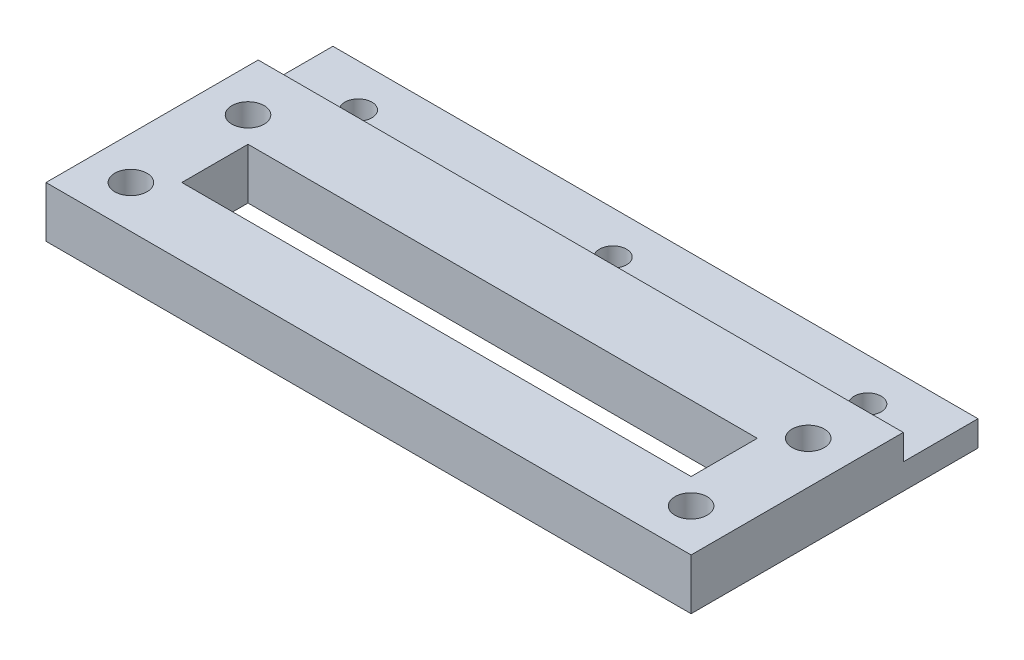
ISO-10303-21;
HEADER;
FILE_DESCRIPTION(('STEP AP214'),'2;1');
FILE_NAME('part.step','',(''),(''),'','','');
FILE_SCHEMA(('AUTOMOTIVE_DESIGN { 1 0 10303 214 1 1 1 1 }'));
ENDSEC;
DATA;
#1=APPLICATION_CONTEXT('core data for automotive mechanical design processes');
#2=APPLICATION_PROTOCOL_DEFINITION('international standard','automotive_design',2000,#1);
#3=PRODUCT_CONTEXT('',#1,'mechanical');
#4=PRODUCT('Part','Part','',(#3));
#5=PRODUCT_RELATED_PRODUCT_CATEGORY('part','',(#4));
#6=PRODUCT_DEFINITION_FORMATION('','',#4);
#7=PRODUCT_DEFINITION_CONTEXT('part definition',#1,'design');
#8=PRODUCT_DEFINITION('design','',#6,#7);
#9=PRODUCT_DEFINITION_SHAPE('','',#8);
#10=(LENGTH_UNIT() NAMED_UNIT(*) SI_UNIT(.MILLI.,.METRE.));
#11=(NAMED_UNIT(*) PLANE_ANGLE_UNIT() SI_UNIT($,.RADIAN.));
#12=(NAMED_UNIT(*) SI_UNIT($,.STERADIAN.) SOLID_ANGLE_UNIT());
#13=UNCERTAINTY_MEASURE_WITH_UNIT(LENGTH_MEASURE(1.E-05),#10,'distance_accuracy_value','');
#14=(GEOMETRIC_REPRESENTATION_CONTEXT(3) GLOBAL_UNCERTAINTY_ASSIGNED_CONTEXT((#13)) GLOBAL_UNIT_ASSIGNED_CONTEXT((#10,
#11,#12)) REPRESENTATION_CONTEXT('',''));
#15=CARTESIAN_POINT('',(0.,0.,0.));
#16=DIRECTION('',(0.,0.,1.));
#17=DIRECTION('',(1.,0.,0.));
#18=AXIS2_PLACEMENT_3D('',#15,#16,#17);
#19=CARTESIAN_POINT('',(0.,3.,0.));
#20=DIRECTION('',(0.,1.,0.));
#21=DIRECTION('',(0.,0.,1.));
#22=AXIS2_PLACEMENT_3D('',#19,#20,#21);
#23=PLANE('',#22);
#24=CARTESIAN_POINT('',(63.,3.,-10.));
#25=DIRECTION('',(0.,1.,0.));
#26=DIRECTION('',(0.,0.,1.));
#27=AXIS2_PLACEMENT_3D('',#24,#25,#26);
#28=CIRCLE('',#27,1.6);
#29=CARTESIAN_POINT('',(63.,3.,-8.4));
#30=VERTEX_POINT('',#29);
#31=EDGE_CURVE('E271',#30,#30,#28,.T.);
#32=ORIENTED_EDGE('',*,*,#31,.F.);
#33=EDGE_LOOP('',(#32));
#34=FACE_BOUND('',#33,.T.);
#35=CARTESIAN_POINT('',(33.,3.,-10.));
#36=DIRECTION('',(0.,1.,0.));
#37=DIRECTION('',(0.,0.,1.));
#38=AXIS2_PLACEMENT_3D('',#35,#36,#37);
#39=CIRCLE('',#38,1.6);
#40=CARTESIAN_POINT('',(33.,3.,-8.4));
#41=VERTEX_POINT('',#40);
#42=EDGE_CURVE('E277',#41,#41,#39,.T.);
#43=ORIENTED_EDGE('',*,*,#42,.F.);
#44=EDGE_LOOP('',(#43));
#45=FACE_BOUND('',#44,.T.);
#46=CARTESIAN_POINT('',(3.,3.,-10.));
#47=DIRECTION('',(0.,1.,0.));
#48=DIRECTION('',(0.,0.,1.));
#49=AXIS2_PLACEMENT_3D('',#46,#47,#48);
#50=CIRCLE('',#49,1.6);
#51=CARTESIAN_POINT('',(3.,3.,-8.4));
#52=VERTEX_POINT('',#51);
#53=EDGE_CURVE('E272',#52,#52,#50,.T.);
#54=ORIENTED_EDGE('',*,*,#53,.F.);
#55=EDGE_LOOP('',(#54));
#56=FACE_BOUND('',#55,.T.);
#57=DIRECTION('',(0.,0.,1.));
#58=VECTOR('',#57,1.);
#59=CARTESIAN_POINT('',(-5.,3.,0.));
#60=LINE('',#59,#58);
#61=CARTESIAN_POINT('',(-5.,3.,-15.));
#62=VERTEX_POINT('',#61);
#63=CARTESIAN_POINT('',(-5.,3.,-6.2));
#64=VERTEX_POINT('',#63);
#65=EDGE_CURVE('E302',#62,#64,#60,.T.);
#66=ORIENTED_EDGE('',*,*,#65,.T.);
#67=DIRECTION('',(1.,0.,0.));
#68=VECTOR('',#67,1.);
#69=CARTESIAN_POINT('',(-5.,3.,-6.2));
#70=LINE('',#69,#68);
#71=CARTESIAN_POINT('',(71.,3.,-6.2));
#72=VERTEX_POINT('',#71);
#73=EDGE_CURVE('E241',#64,#72,#70,.T.);
#74=ORIENTED_EDGE('',*,*,#73,.T.);
#75=DIRECTION('',(0.,0.,1.));
#76=VECTOR('',#75,1.);
#77=CARTESIAN_POINT('',(71.,3.,0.));
#78=LINE('',#77,#76);
#79=CARTESIAN_POINT('',(71.,3.,-15.));
#80=VERTEX_POINT('',#79);
#81=EDGE_CURVE('E306',#80,#72,#78,.T.);
#82=ORIENTED_EDGE('',*,*,#81,.F.);
#83=DIRECTION('',(1.,0.,0.));
#84=VECTOR('',#83,1.);
#85=CARTESIAN_POINT('',(-5.,3.,-15.));
#86=LINE('',#85,#84);
#87=EDGE_CURVE('E297',#62,#80,#86,.T.);
#88=ORIENTED_EDGE('',*,*,#87,.F.);
#89=EDGE_LOOP('',(#66,#74,#82,#88));
#90=FACE_BOUND('',#89,.T.);
#91=ADVANCED_FACE('F129',(#34,#45,#56,#90),#23,.T.);
#92=CARTESIAN_POINT('',(0.,0.,0.));
#93=DIRECTION('',(0.,1.,0.));
#94=DIRECTION('',(0.,0.,1.));
#95=AXIS2_PLACEMENT_3D('',#92,#93,#94);
#96=PLANE('',#95);
#97=DIRECTION('',(0.,0.,1.));
#98=VECTOR('',#97,1.);
#99=CARTESIAN_POINT('',(-5.,0.,0.));
#100=LINE('',#99,#98);
#101=CARTESIAN_POINT('',(-5.,0.,-15.));
#102=VERTEX_POINT('',#101);
#103=CARTESIAN_POINT('',(-5.,0.,18.8));
#104=VERTEX_POINT('',#103);
#105=EDGE_CURVE('E327',#102,#104,#100,.T.);
#106=ORIENTED_EDGE('',*,*,#105,.F.);
#107=DIRECTION('',(-1.,0.,0.));
#108=VECTOR('',#107,1.);
#109=CARTESIAN_POINT('',(71.,0.,-15.));
#110=LINE('',#109,#108);
#111=CARTESIAN_POINT('',(71.,0.,-15.));
#112=VERTEX_POINT('',#111);
#113=EDGE_CURVE('E288',#112,#102,#110,.T.);
#114=ORIENTED_EDGE('',*,*,#113,.F.);
#115=DIRECTION('',(0.,0.,1.));
#116=VECTOR('',#115,1.);
#117=CARTESIAN_POINT('',(71.,0.,0.));
#118=LINE('',#117,#116);
#119=CARTESIAN_POINT('',(71.,0.,18.8));
#120=VERTEX_POINT('',#119);
#121=EDGE_CURVE('E307',#112,#120,#118,.T.);
#122=ORIENTED_EDGE('',*,*,#121,.T.);
#123=DIRECTION('',(1.,0.,0.));
#124=VECTOR('',#123,1.);
#125=CARTESIAN_POINT('',(0.,0.,18.8));
#126=LINE('',#125,#124);
#127=EDGE_CURVE('E331',#104,#120,#126,.T.);
#128=ORIENTED_EDGE('',*,*,#127,.F.);
#129=EDGE_LOOP('',(#106,#114,#122,#128));
#130=FACE_BOUND('',#129,.T.);
#131=CARTESIAN_POINT('',(0.,0.,0.));
#132=DIRECTION('',(0.,1.,0.));
#133=DIRECTION('',(0.,0.,1.));
#134=AXIS2_PLACEMENT_3D('',#131,#132,#133);
#135=CIRCLE('',#134,1.9);
#136=CARTESIAN_POINT('',(0.,0.,1.9));
#137=VERTEX_POINT('',#136);
#138=EDGE_CURVE('E323',#137,#137,#135,.T.);
#139=ORIENTED_EDGE('',*,*,#138,.T.);
#140=EDGE_LOOP('',(#139));
#141=FACE_BOUND('',#140,.T.);
#142=CARTESIAN_POINT('',(0.,0.,13.8));
#143=DIRECTION('',(0.,1.,0.));
#144=DIRECTION('',(0.,0.,1.));
#145=AXIS2_PLACEMENT_3D('',#142,#143,#144);
#146=CIRCLE('',#145,1.9);
#147=CARTESIAN_POINT('',(0.,0.,15.7));
#148=VERTEX_POINT('',#147);
#149=EDGE_CURVE('E319',#148,#148,#146,.T.);
#150=ORIENTED_EDGE('',*,*,#149,.T.);
#151=EDGE_LOOP('',(#150));
#152=FACE_BOUND('',#151,.T.);
#153=CARTESIAN_POINT('',(66.,0.,0.));
#154=DIRECTION('',(0.,1.,0.));
#155=DIRECTION('',(0.,0.,1.));
#156=AXIS2_PLACEMENT_3D('',#153,#154,#155);
#157=CIRCLE('',#156,1.9);
#158=CARTESIAN_POINT('',(66.,0.,1.9));
#159=VERTEX_POINT('',#158);
#160=EDGE_CURVE('E315',#159,#159,#157,.T.);
#161=ORIENTED_EDGE('',*,*,#160,.T.);
#162=EDGE_LOOP('',(#161));
#163=FACE_BOUND('',#162,.T.);
#164=CARTESIAN_POINT('',(66.,0.,13.8));
#165=DIRECTION('',(0.,1.,0.));
#166=DIRECTION('',(0.,0.,1.));
#167=AXIS2_PLACEMENT_3D('',#164,#165,#166);
#168=CIRCLE('',#167,1.9);
#169=CARTESIAN_POINT('',(66.,0.,15.7));
#170=VERTEX_POINT('',#169);
#171=EDGE_CURVE('E301',#170,#170,#168,.T.);
#172=ORIENTED_EDGE('',*,*,#171,.T.);
#173=EDGE_LOOP('',(#172));
#174=FACE_BOUND('',#173,.T.);
#175=CARTESIAN_POINT('',(63.,0.,-10.));
#176=DIRECTION('',(0.,1.,0.));
#177=DIRECTION('',(0.,0.,1.));
#178=AXIS2_PLACEMENT_3D('',#175,#176,#177);
#179=CIRCLE('',#178,1.6);
#180=CARTESIAN_POINT('',(63.,0.,-8.4));
#181=VERTEX_POINT('',#180);
#182=EDGE_CURVE('E276',#181,#181,#179,.T.);
#183=ORIENTED_EDGE('',*,*,#182,.T.);
#184=EDGE_LOOP('',(#183));
#185=FACE_BOUND('',#184,.T.);
#186=CARTESIAN_POINT('',(33.,0.,-10.));
#187=DIRECTION('',(0.,1.,0.));
#188=DIRECTION('',(0.,0.,1.));
#189=AXIS2_PLACEMENT_3D('',#186,#187,#188);
#190=CIRCLE('',#189,1.6);
#191=CARTESIAN_POINT('',(33.,0.,-8.4));
#192=VERTEX_POINT('',#191);
#193=EDGE_CURVE('E348',#192,#192,#190,.T.);
#194=ORIENTED_EDGE('',*,*,#193,.T.);
#195=EDGE_LOOP('',(#194));
#196=FACE_BOUND('',#195,.T.);
#197=CARTESIAN_POINT('',(3.,0.,-10.));
#198=DIRECTION('',(0.,1.,0.));
#199=DIRECTION('',(0.,0.,1.));
#200=AXIS2_PLACEMENT_3D('',#197,#198,#199);
#201=CIRCLE('',#200,1.6);
#202=CARTESIAN_POINT('',(3.,0.,-8.4));
#203=VERTEX_POINT('',#202);
#204=EDGE_CURVE('E289',#203,#203,#201,.T.);
#205=ORIENTED_EDGE('',*,*,#204,.T.);
#206=EDGE_LOOP('',(#205));
#207=FACE_BOUND('',#206,.T.);
#208=DIRECTION('',(1.,0.,0.));
#209=VECTOR('',#208,1.);
#210=CARTESIAN_POINT('',(0.,0.,3.));
#211=LINE('',#210,#209);
#212=CARTESIAN_POINT('',(3.,0.,3.));
#213=VERTEX_POINT('',#212);
#214=CARTESIAN_POINT('',(63.,0.,3.));
#215=VERTEX_POINT('',#214);
#216=EDGE_CURVE('E12',#213,#215,#211,.T.);
#217=ORIENTED_EDGE('',*,*,#216,.F.);
#218=DIRECTION('',(0.,0.,1.));
#219=VECTOR('',#218,1.);
#220=CARTESIAN_POINT('',(3.,0.,0.));
#221=LINE('',#220,#219);
#222=CARTESIAN_POINT('',(3.,0.,10.8));
#223=VERTEX_POINT('',#222);
#224=EDGE_CURVE('E344',#213,#223,#221,.T.);
#225=ORIENTED_EDGE('',*,*,#224,.T.);
#226=DIRECTION('',(1.,0.,0.));
#227=VECTOR('',#226,1.);
#228=CARTESIAN_POINT('',(0.,0.,10.8));
#229=LINE('',#228,#227);
#230=CARTESIAN_POINT('',(63.,0.,10.8));
#231=VERTEX_POINT('',#230);
#232=EDGE_CURVE('E212',#223,#231,#229,.T.);
#233=ORIENTED_EDGE('',*,*,#232,.T.);
#234=DIRECTION('',(0.,0.,1.));
#235=VECTOR('',#234,1.);
#236=CARTESIAN_POINT('',(63.,0.,0.));
#237=LINE('',#236,#235);
#238=EDGE_CURVE('E138',#215,#231,#237,.T.);
#239=ORIENTED_EDGE('',*,*,#238,.F.);
#240=EDGE_LOOP('',(#217,#225,#233,#239));
#241=FACE_BOUND('',#240,.T.);
#242=ADVANCED_FACE('F365',(#130,#141,#152,#163,#174,#185,#196,#207,#241),#96,.F.);
#243=CARTESIAN_POINT('',(-5.,3.,0.));
#244=DIRECTION('',(1.,0.,0.));
#245=DIRECTION('',(0.,0.,-1.));
#246=AXIS2_PLACEMENT_3D('',#243,#244,#245);
#247=PLANE('',#246);
#248=ORIENTED_EDGE('',*,*,#105,.T.);
#249=DIRECTION('',(0.,-1.,0.));
#250=VECTOR('',#249,1.);
#251=CARTESIAN_POINT('',(-5.,3.,18.8));
#252=LINE('',#251,#250);
#253=CARTESIAN_POINT('',(-5.,6.,18.8));
#254=VERTEX_POINT('',#253);
#255=EDGE_CURVE('E340',#254,#104,#252,.T.);
#256=ORIENTED_EDGE('',*,*,#255,.F.);
#257=DIRECTION('',(0.,0.,1.));
#258=VECTOR('',#257,1.);
#259=CARTESIAN_POINT('',(-5.,6.,-6.2));
#260=LINE('',#259,#258);
#261=CARTESIAN_POINT('',(-5.,6.,-6.2));
#262=VERTEX_POINT('',#261);
#263=EDGE_CURVE('E253',#262,#254,#260,.T.);
#264=ORIENTED_EDGE('',*,*,#263,.F.);
#265=DIRECTION('',(0.,-1.,0.));
#266=VECTOR('',#265,1.);
#267=CARTESIAN_POINT('',(-5.,6.,-6.2));
#268=LINE('',#267,#266);
#269=EDGE_CURVE('E257',#262,#64,#268,.T.);
#270=ORIENTED_EDGE('',*,*,#269,.T.);
#271=ORIENTED_EDGE('',*,*,#65,.F.);
#272=DIRECTION('',(0.,1.,0.));
#273=VECTOR('',#272,1.);
#274=CARTESIAN_POINT('',(-5.,0.,-15.));
#275=LINE('',#274,#273);
#276=EDGE_CURVE('E293',#102,#62,#275,.T.);
#277=ORIENTED_EDGE('',*,*,#276,.F.);
#278=EDGE_LOOP('',(#248,#256,#264,#270,#271,#277));
#279=FACE_BOUND('',#278,.T.);
#280=ADVANCED_FACE('F385',(#279),#247,.F.);
#281=CARTESIAN_POINT('',(0.,3.,18.8));
#282=DIRECTION('',(0.,0.,-1.));
#283=DIRECTION('',(-1.,0.,0.));
#284=AXIS2_PLACEMENT_3D('',#281,#282,#283);
#285=PLANE('',#284);
#286=ORIENTED_EDGE('',*,*,#127,.T.);
#287=DIRECTION('',(0.,-1.,0.));
#288=VECTOR('',#287,1.);
#289=CARTESIAN_POINT('',(71.,3.,18.8));
#290=LINE('',#289,#288);
#291=CARTESIAN_POINT('',(71.,6.,18.8));
#292=VERTEX_POINT('',#291);
#293=EDGE_CURVE('E311',#292,#120,#290,.T.);
#294=ORIENTED_EDGE('',*,*,#293,.F.);
#295=DIRECTION('',(1.,0.,0.));
#296=VECTOR('',#295,1.);
#297=CARTESIAN_POINT('',(-5.,6.,18.8));
#298=LINE('',#297,#296);
#299=EDGE_CURVE('E242',#254,#292,#298,.T.);
#300=ORIENTED_EDGE('',*,*,#299,.F.);
#301=ORIENTED_EDGE('',*,*,#255,.T.);
#302=EDGE_LOOP('',(#286,#294,#300,#301));
#303=FACE_BOUND('',#302,.T.);
#304=ADVANCED_FACE('F398',(#303),#285,.F.);
#305=CARTESIAN_POINT('',(0.,3.,0.));
#306=DIRECTION('',(0.,-1.,0.));
#307=DIRECTION('',(0.,0.,-1.));
#308=AXIS2_PLACEMENT_3D('',#305,#306,#307);
#309=CYLINDRICAL_SURFACE('',#308,1.9);
#310=ORIENTED_EDGE('',*,*,#138,.F.);
#311=EDGE_LOOP('',(#310));
#312=FACE_BOUND('',#311,.T.);
#313=CARTESIAN_POINT('',(0.,6.,0.));
#314=DIRECTION('',(0.,1.,0.));
#315=DIRECTION('',(0.,0.,1.));
#316=AXIS2_PLACEMENT_3D('',#313,#314,#315);
#317=CIRCLE('',#316,1.9);
#318=CARTESIAN_POINT('',(0.,6.,1.9));
#319=VERTEX_POINT('',#318);
#320=EDGE_CURVE('E226',#319,#319,#317,.F.);
#321=ORIENTED_EDGE('',*,*,#320,.F.);
#322=EDGE_LOOP('',(#321));
#323=FACE_BOUND('',#322,.T.);
#324=ADVANCED_FACE('F401',(#312,#323),#309,.F.);
#325=CARTESIAN_POINT('',(0.,3.,13.8));
#326=DIRECTION('',(0.,-1.,0.));
#327=DIRECTION('',(0.,0.,-1.));
#328=AXIS2_PLACEMENT_3D('',#325,#326,#327);
#329=CYLINDRICAL_SURFACE('',#328,1.9);
#330=ORIENTED_EDGE('',*,*,#149,.F.);
#331=EDGE_LOOP('',(#330));
#332=FACE_BOUND('',#331,.T.);
#333=CARTESIAN_POINT('',(0.,6.,13.8));
#334=DIRECTION('',(0.,1.,0.));
#335=DIRECTION('',(0.,0.,1.));
#336=AXIS2_PLACEMENT_3D('',#333,#334,#335);
#337=CIRCLE('',#336,1.9);
#338=CARTESIAN_POINT('',(0.,6.,15.7));
#339=VERTEX_POINT('',#338);
#340=EDGE_CURVE('E430',#339,#339,#337,.F.);
#341=ORIENTED_EDGE('',*,*,#340,.F.);
#342=EDGE_LOOP('',(#341));
#343=FACE_BOUND('',#342,.T.);
#344=ADVANCED_FACE('F408',(#332,#343),#329,.F.);
#345=CARTESIAN_POINT('',(66.,3.,0.));
#346=DIRECTION('',(0.,-1.,0.));
#347=DIRECTION('',(0.,0.,-1.));
#348=AXIS2_PLACEMENT_3D('',#345,#346,#347);
#349=CYLINDRICAL_SURFACE('',#348,1.9);
#350=ORIENTED_EDGE('',*,*,#160,.F.);
#351=EDGE_LOOP('',(#350));
#352=FACE_BOUND('',#351,.T.);
#353=CARTESIAN_POINT('',(66.,6.,0.));
#354=DIRECTION('',(0.,1.,0.));
#355=DIRECTION('',(0.,0.,1.));
#356=AXIS2_PLACEMENT_3D('',#353,#354,#355);
#357=CIRCLE('',#356,1.9);
#358=CARTESIAN_POINT('',(66.,6.,1.9));
#359=VERTEX_POINT('',#358);
#360=EDGE_CURVE('E423',#359,#359,#357,.F.);
#361=ORIENTED_EDGE('',*,*,#360,.F.);
#362=EDGE_LOOP('',(#361));
#363=FACE_BOUND('',#362,.T.);
#364=ADVANCED_FACE('F411',(#352,#363),#349,.F.);
#365=CARTESIAN_POINT('',(66.,3.,13.8));
#366=DIRECTION('',(0.,-1.,0.));
#367=DIRECTION('',(0.,0.,-1.));
#368=AXIS2_PLACEMENT_3D('',#365,#366,#367);
#369=CYLINDRICAL_SURFACE('',#368,1.9);
#370=ORIENTED_EDGE('',*,*,#171,.F.);
#371=EDGE_LOOP('',(#370));
#372=FACE_BOUND('',#371,.T.);
#373=CARTESIAN_POINT('',(66.,6.,13.8));
#374=DIRECTION('',(0.,1.,0.));
#375=DIRECTION('',(0.,0.,1.));
#376=AXIS2_PLACEMENT_3D('',#373,#374,#375);
#377=CIRCLE('',#376,1.9);
#378=CARTESIAN_POINT('',(66.,6.,15.7));
#379=VERTEX_POINT('',#378);
#380=EDGE_CURVE('E426',#379,#379,#377,.F.);
#381=ORIENTED_EDGE('',*,*,#380,.F.);
#382=EDGE_LOOP('',(#381));
#383=FACE_BOUND('',#382,.T.);
#384=ADVANCED_FACE('F131',(#372,#383),#369,.F.);
#385=CARTESIAN_POINT('',(71.,3.,0.));
#386=DIRECTION('',(1.,0.,0.));
#387=DIRECTION('',(0.,0.,-1.));
#388=AXIS2_PLACEMENT_3D('',#385,#386,#387);
#389=PLANE('',#388);
#390=ORIENTED_EDGE('',*,*,#121,.F.);
#391=DIRECTION('',(0.,-1.,0.));
#392=VECTOR('',#391,1.);
#393=CARTESIAN_POINT('',(71.,3.,-15.));
#394=LINE('',#393,#392);
#395=EDGE_CURVE('E284',#80,#112,#394,.T.);
#396=ORIENTED_EDGE('',*,*,#395,.F.);
#397=ORIENTED_EDGE('',*,*,#81,.T.);
#398=DIRECTION('',(0.,-1.,0.));
#399=VECTOR('',#398,1.);
#400=CARTESIAN_POINT('',(71.,6.,-6.2));
#401=LINE('',#400,#399);
#402=CARTESIAN_POINT('',(71.,6.,-6.2));
#403=VERTEX_POINT('',#402);
#404=EDGE_CURVE('E145',#403,#72,#401,.T.);
#405=ORIENTED_EDGE('',*,*,#404,.F.);
#406=DIRECTION('',(0.,0.,1.));
#407=VECTOR('',#406,1.);
#408=CARTESIAN_POINT('',(71.,6.,-6.2));
#409=LINE('',#408,#407);
#410=EDGE_CURVE('E246',#403,#292,#409,.T.);
#411=ORIENTED_EDGE('',*,*,#410,.T.);
#412=ORIENTED_EDGE('',*,*,#293,.T.);
#413=EDGE_LOOP('',(#390,#396,#397,#405,#411,#412));
#414=FACE_BOUND('',#413,.T.);
#415=ADVANCED_FACE('F394',(#414),#389,.T.);
#416=CARTESIAN_POINT('',(0.,0.,-15.));
#417=DIRECTION('',(0.,0.,-1.));
#418=DIRECTION('',(-1.,0.,0.));
#419=AXIS2_PLACEMENT_3D('',#416,#417,#418);
#420=PLANE('',#419);
#421=ORIENTED_EDGE('',*,*,#395,.T.);
#422=ORIENTED_EDGE('',*,*,#113,.T.);
#423=ORIENTED_EDGE('',*,*,#276,.T.);
#424=ORIENTED_EDGE('',*,*,#87,.T.);
#425=EDGE_LOOP('',(#421,#422,#423,#424));
#426=FACE_BOUND('',#425,.T.);
#427=ADVANCED_FACE('F391',(#426),#420,.T.);
#428=CARTESIAN_POINT('',(63.,-7.,-10.));
#429=DIRECTION('',(0.,1.,0.));
#430=DIRECTION('',(0.,0.,1.));
#431=AXIS2_PLACEMENT_3D('',#428,#429,#430);
#432=CYLINDRICAL_SURFACE('',#431,1.6);
#433=ORIENTED_EDGE('',*,*,#31,.T.);
#434=EDGE_LOOP('',(#433));
#435=FACE_BOUND('',#434,.T.);
#436=ORIENTED_EDGE('',*,*,#182,.F.);
#437=EDGE_LOOP('',(#436));
#438=FACE_BOUND('',#437,.T.);
#439=ADVANCED_FACE('F538',(#435,#438),#432,.F.);
#440=CARTESIAN_POINT('',(33.,-7.,-10.));
#441=DIRECTION('',(0.,1.,0.));
#442=DIRECTION('',(0.,0.,1.));
#443=AXIS2_PLACEMENT_3D('',#440,#441,#442);
#444=CYLINDRICAL_SURFACE('',#443,1.6);
#445=ORIENTED_EDGE('',*,*,#42,.T.);
#446=EDGE_LOOP('',(#445));
#447=FACE_BOUND('',#446,.T.);
#448=ORIENTED_EDGE('',*,*,#193,.F.);
#449=EDGE_LOOP('',(#448));
#450=FACE_BOUND('',#449,.T.);
#451=ADVANCED_FACE('F376',(#447,#450),#444,.F.);
#452=CARTESIAN_POINT('',(3.,-7.,-10.));
#453=DIRECTION('',(0.,1.,0.));
#454=DIRECTION('',(0.,0.,1.));
#455=AXIS2_PLACEMENT_3D('',#452,#453,#454);
#456=CYLINDRICAL_SURFACE('',#455,1.6);
#457=ORIENTED_EDGE('',*,*,#53,.T.);
#458=EDGE_LOOP('',(#457));
#459=FACE_BOUND('',#458,.T.);
#460=ORIENTED_EDGE('',*,*,#204,.F.);
#461=EDGE_LOOP('',(#460));
#462=FACE_BOUND('',#461,.T.);
#463=ADVANCED_FACE('F369',(#459,#462),#456,.F.);
#464=CARTESIAN_POINT('',(3.,-7.,3.));
#465=DIRECTION('',(0.,0.,1.));
#466=DIRECTION('',(1.,0.,0.));
#467=AXIS2_PLACEMENT_3D('',#464,#465,#466);
#468=PLANE('',#467);
#469=ORIENTED_EDGE('',*,*,#216,.T.);
#470=DIRECTION('',(0.,1.,0.));
#471=VECTOR('',#470,1.);
#472=CARTESIAN_POINT('',(63.,-7.,3.));
#473=LINE('',#472,#471);
#474=CARTESIAN_POINT('',(63.,6.,3.));
#475=VERTEX_POINT('',#474);
#476=EDGE_CURVE('E268',#215,#475,#473,.T.);
#477=ORIENTED_EDGE('',*,*,#476,.T.);
#478=DIRECTION('',(1.,0.,0.));
#479=VECTOR('',#478,1.);
#480=CARTESIAN_POINT('',(0.,6.,3.));
#481=LINE('',#480,#479);
#482=CARTESIAN_POINT('',(3.,6.,3.));
#483=VERTEX_POINT('',#482);
#484=EDGE_CURVE('E235',#483,#475,#481,.T.);
#485=ORIENTED_EDGE('',*,*,#484,.F.);
#486=DIRECTION('',(0.,1.,0.));
#487=VECTOR('',#486,1.);
#488=CARTESIAN_POINT('',(3.,-7.,3.));
#489=LINE('',#488,#487);
#490=EDGE_CURVE('E216',#213,#483,#489,.T.);
#491=ORIENTED_EDGE('',*,*,#490,.F.);
#492=EDGE_LOOP('',(#469,#477,#485,#491));
#493=FACE_BOUND('',#492,.T.);
#494=ADVANCED_FACE('F367',(#493),#468,.T.);
#495=CARTESIAN_POINT('',(63.,-7.,3.));
#496=DIRECTION('',(-1.,0.,0.));
#497=DIRECTION('',(0.,0.,1.));
#498=AXIS2_PLACEMENT_3D('',#495,#496,#497);
#499=PLANE('',#498);
#500=ORIENTED_EDGE('',*,*,#238,.T.);
#501=DIRECTION('',(0.,1.,0.));
#502=VECTOR('',#501,1.);
#503=CARTESIAN_POINT('',(63.,-7.,10.8));
#504=LINE('',#503,#502);
#505=CARTESIAN_POINT('',(63.,6.,10.8));
#506=VERTEX_POINT('',#505);
#507=EDGE_CURVE('E215',#231,#506,#504,.T.);
#508=ORIENTED_EDGE('',*,*,#507,.T.);
#509=DIRECTION('',(0.,0.,1.));
#510=VECTOR('',#509,1.);
#511=CARTESIAN_POINT('',(63.,6.,0.));
#512=LINE('',#511,#510);
#513=EDGE_CURVE('E231',#475,#506,#512,.T.);
#514=ORIENTED_EDGE('',*,*,#513,.F.);
#515=ORIENTED_EDGE('',*,*,#476,.F.);
#516=EDGE_LOOP('',(#500,#508,#514,#515));
#517=FACE_BOUND('',#516,.T.);
#518=ADVANCED_FACE('F362',(#517),#499,.T.);
#519=CARTESIAN_POINT('',(3.,-7.,10.8));
#520=DIRECTION('',(0.,0.,1.));
#521=DIRECTION('',(1.,0.,0.));
#522=AXIS2_PLACEMENT_3D('',#519,#520,#521);
#523=PLANE('',#522);
#524=DIRECTION('',(0.,1.,0.));
#525=VECTOR('',#524,1.);
#526=CARTESIAN_POINT('',(3.,-7.,10.8));
#527=LINE('',#526,#525);
#528=CARTESIAN_POINT('',(3.,6.,10.8));
#529=VERTEX_POINT('',#528);
#530=EDGE_CURVE('E153',#223,#529,#527,.T.);
#531=ORIENTED_EDGE('',*,*,#530,.T.);
#532=DIRECTION('',(-1.,0.,0.));
#533=VECTOR('',#532,1.);
#534=CARTESIAN_POINT('',(0.,6.,10.8));
#535=LINE('',#534,#533);
#536=EDGE_CURVE('E209',#506,#529,#535,.T.);
#537=ORIENTED_EDGE('',*,*,#536,.F.);
#538=ORIENTED_EDGE('',*,*,#507,.F.);
#539=ORIENTED_EDGE('',*,*,#232,.F.);
#540=EDGE_LOOP('',(#531,#537,#538,#539));
#541=FACE_BOUND('',#540,.T.);
#542=ADVANCED_FACE('F206',(#541),#523,.F.);
#543=CARTESIAN_POINT('',(3.,-7.,3.));
#544=DIRECTION('',(-1.,0.,0.));
#545=DIRECTION('',(0.,0.,1.));
#546=AXIS2_PLACEMENT_3D('',#543,#544,#545);
#547=PLANE('',#546);
#548=ORIENTED_EDGE('',*,*,#490,.T.);
#549=DIRECTION('',(0.,0.,-1.));
#550=VECTOR('',#549,1.);
#551=CARTESIAN_POINT('',(3.,6.,0.));
#552=LINE('',#551,#550);
#553=EDGE_CURVE('E219',#529,#483,#552,.T.);
#554=ORIENTED_EDGE('',*,*,#553,.F.);
#555=ORIENTED_EDGE('',*,*,#530,.F.);
#556=ORIENTED_EDGE('',*,*,#224,.F.);
#557=EDGE_LOOP('',(#548,#554,#555,#556));
#558=FACE_BOUND('',#557,.T.);
#559=ADVANCED_FACE('F220',(#558),#547,.F.);
#560=CARTESIAN_POINT('',(-5.,6.,-6.2));
#561=DIRECTION('',(0.,0.,-1.));
#562=DIRECTION('',(-1.,0.,0.));
#563=AXIS2_PLACEMENT_3D('',#560,#561,#562);
#564=PLANE('',#563);
#565=ORIENTED_EDGE('',*,*,#73,.F.);
#566=ORIENTED_EDGE('',*,*,#269,.F.);
#567=DIRECTION('',(1.,0.,0.));
#568=VECTOR('',#567,1.);
#569=CARTESIAN_POINT('',(-5.,6.,-6.2));
#570=LINE('',#569,#568);
#571=EDGE_CURVE('E250',#262,#403,#570,.T.);
#572=ORIENTED_EDGE('',*,*,#571,.T.);
#573=ORIENTED_EDGE('',*,*,#404,.T.);
#574=EDGE_LOOP('',(#565,#566,#572,#573));
#575=FACE_BOUND('',#574,.T.);
#576=ADVANCED_FACE('F441',(#575),#564,.T.);
#577=CARTESIAN_POINT('',(0.,6.,0.));
#578=DIRECTION('',(0.,-1.,0.));
#579=DIRECTION('',(0.,0.,-1.));
#580=AXIS2_PLACEMENT_3D('',#577,#578,#579);
#581=PLANE('',#580);
#582=ORIENTED_EDGE('',*,*,#360,.T.);
#583=EDGE_LOOP('',(#582));
#584=FACE_BOUND('',#583,.T.);
#585=ORIENTED_EDGE('',*,*,#380,.T.);
#586=EDGE_LOOP('',(#585));
#587=FACE_BOUND('',#586,.T.);
#588=ORIENTED_EDGE('',*,*,#340,.T.);
#589=EDGE_LOOP('',(#588));
#590=FACE_BOUND('',#589,.T.);
#591=ORIENTED_EDGE('',*,*,#320,.T.);
#592=EDGE_LOOP('',(#591));
#593=FACE_BOUND('',#592,.T.);
#594=ORIENTED_EDGE('',*,*,#536,.T.);
#595=ORIENTED_EDGE('',*,*,#553,.T.);
#596=ORIENTED_EDGE('',*,*,#484,.T.);
#597=ORIENTED_EDGE('',*,*,#513,.T.);
#598=EDGE_LOOP('',(#594,#595,#596,#597));
#599=FACE_BOUND('',#598,.T.);
#600=ORIENTED_EDGE('',*,*,#299,.T.);
#601=ORIENTED_EDGE('',*,*,#410,.F.);
#602=ORIENTED_EDGE('',*,*,#571,.F.);
#603=ORIENTED_EDGE('',*,*,#263,.T.);
#604=EDGE_LOOP('',(#600,#601,#602,#603));
#605=FACE_BOUND('',#604,.T.);
#606=ADVANCED_FACE('F228',(#584,#587,#590,#593,#599,#605),#581,.F.);
#607=CLOSED_SHELL('',(#91,#242,#280,#304,#324,#344,#364,#384,#415,#427,#439,#451,#463,#494,#518,
#542,#559,#576,#606));
#608=MANIFOLD_SOLID_BREP('B2',#607);
#609=ADVANCED_BREP_SHAPE_REPRESENTATION('',(#18,#608),#14);
#610=SHAPE_DEFINITION_REPRESENTATION(#9,#609);
ENDSEC;
END-ISO-10303-21;
